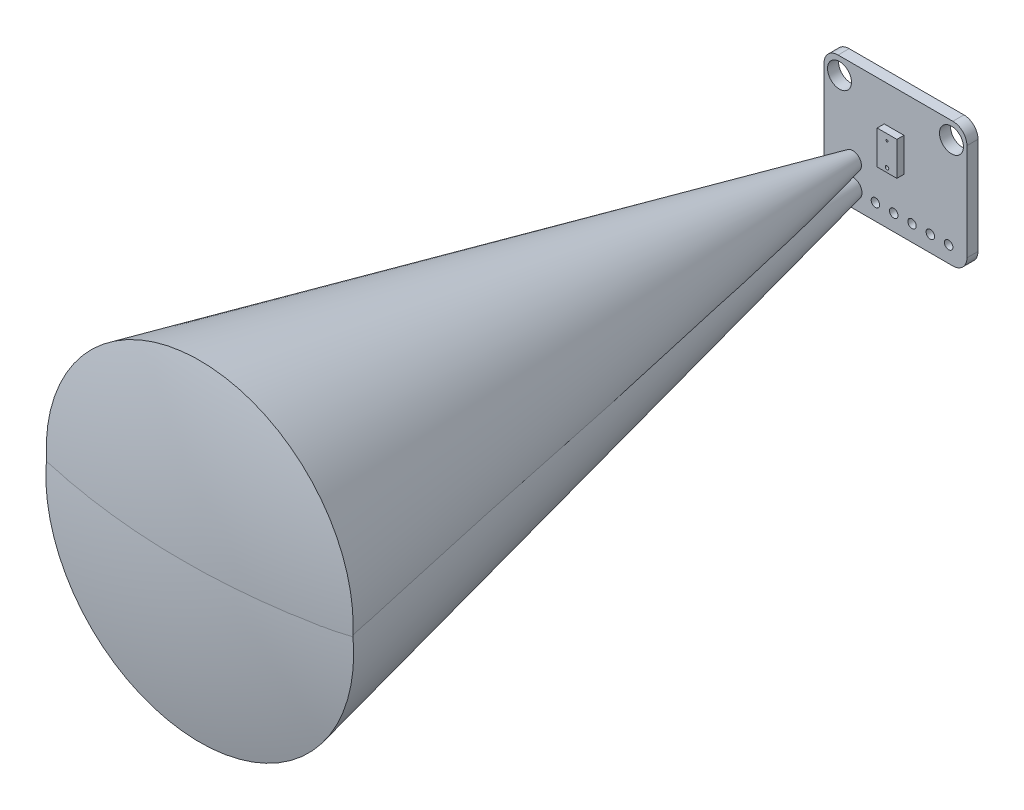
ISO-10303-21;
HEADER;
FILE_DESCRIPTION(('STEP AP214'),'2;1');
FILE_NAME('part.step','',(''),(''),'','','');
FILE_SCHEMA(('AUTOMOTIVE_DESIGN { 1 0 10303 214 1 1 1 1 }'));
ENDSEC;
DATA;
#1=APPLICATION_CONTEXT('core data for automotive mechanical design processes');
#2=APPLICATION_PROTOCOL_DEFINITION('international standard','automotive_design',2000,#1);
#3=PRODUCT_CONTEXT('',#1,'mechanical');
#4=PRODUCT('Part','Part','',(#3));
#5=PRODUCT_RELATED_PRODUCT_CATEGORY('part','',(#4));
#6=PRODUCT_DEFINITION_FORMATION('','',#4);
#7=PRODUCT_DEFINITION_CONTEXT('part definition',#1,'design');
#8=PRODUCT_DEFINITION('design','',#6,#7);
#9=PRODUCT_DEFINITION_SHAPE('','',#8);
#10=(LENGTH_UNIT() NAMED_UNIT(*) SI_UNIT(.MILLI.,.METRE.));
#11=(NAMED_UNIT(*) PLANE_ANGLE_UNIT() SI_UNIT($,.RADIAN.));
#12=(NAMED_UNIT(*) SI_UNIT($,.STERADIAN.) SOLID_ANGLE_UNIT());
#13=UNCERTAINTY_MEASURE_WITH_UNIT(LENGTH_MEASURE(1.E-05),#10,'distance_accuracy_value','');
#14=(GEOMETRIC_REPRESENTATION_CONTEXT(3) GLOBAL_UNCERTAINTY_ASSIGNED_CONTEXT((#13)) GLOBAL_UNIT_ASSIGNED_CONTEXT((#10,
#11,#12)) REPRESENTATION_CONTEXT('',''));
#15=CARTESIAN_POINT('',(0.,0.,0.));
#16=DIRECTION('',(0.,0.,1.));
#17=DIRECTION('',(1.,0.,0.));
#18=AXIS2_PLACEMENT_3D('',#15,#16,#17);
#19=CARTESIAN_POINT('',(-0.2,-0.499999999999998,1.57));
#20=DIRECTION('',(0.,0.,1.));
#21=DIRECTION('',(-1.,0.,0.));
#22=AXIS2_PLACEMENT_3D('',#19,#20,#21);
#23=SPHERICAL_SURFACE('',#22,6.);
#24=CARTESIAN_POINT('',(-0.2,-0.499999999999998,7.4277760427196));
#25=DIRECTION('',(0.,0.,1.));
#26=DIRECTION('',(1.,0.,0.));
#27=AXIS2_PLACEMENT_3D('',#24,#25,#26);
#28=CIRCLE('',#27,1.29863768362862);
#29=CARTESIAN_POINT('',(1.09863768362862,-0.499999999999998,7.4277760427196));
#30=VERTEX_POINT('',#29);
#31=EDGE_CURVE('E49',#30,#30,#28,.T.);
#32=ORIENTED_EDGE('',*,*,#31,.F.);
#33=EDGE_LOOP('',(#32));
#34=FACE_BOUND('',#33,.T.);
#35=ADVANCED_FACE('F43',(#34),#23,.F.);
#36=CARTESIAN_POINT('',(-0.2,-0.499999999999998,1.57));
#37=DIRECTION('',(0.,0.,1.));
#38=DIRECTION('',(1.,0.,0.));
#39=AXIS2_PLACEMENT_3D('',#36,#37,#38);
#40=SPHERICAL_SURFACE('',#39,101.);
#41=CARTESIAN_POINT('',(-0.2,-0.499999999999998,100.175896719113));
#42=DIRECTION('',(0.,0.,1.));
#43=DIRECTION('',(1.,0.,0.));
#44=AXIS2_PLACEMENT_3D('',#41,#42,#43);
#45=CIRCLE('',#44,21.8604010077484);
#46=CARTESIAN_POINT('',(21.6604010077484,-0.499999999999998,100.175896719113));
#47=VERTEX_POINT('',#46);
#48=EDGE_CURVE('E11',#47,#47,#45,.T.);
#49=ORIENTED_EDGE('',*,*,#48,.T.);
#50=EDGE_LOOP('',(#49));
#51=FACE_BOUND('',#50,.T.);
#52=ADVANCED_FACE('F58',(#51),#40,.T.);
#53=CARTESIAN_POINT('',(-0.2,-0.499999999999998,7.4277760427196));
#54=DIRECTION('',(0.,0.,1.));
#55=DIRECTION('',(1.,0.,0.));
#56=AXIS2_PLACEMENT_3D('',#53,#54,#55);
#57=CONICAL_SURFACE('',#56,1.29863768362862,0.218166156499292);
#58=CARTESIAN_POINT('',(21.6604010077484,-0.499999999999998,100.175896719113));
#59=CARTESIAN_POINT('',(21.4462159731222,-0.499999999999998,99.2097704620675));
#60=CARTESIAN_POINT('',(21.2320309384959,-0.499999999999998,98.2436442050218));
#61=CARTESIAN_POINT('',(20.8036608692435,-0.499999999999998,96.3113916909302));
#62=CARTESIAN_POINT('',(20.5894758346172,-0.499999999999998,95.3452654338844));
#63=CARTESIAN_POINT('',(20.1611057653647,-0.499999999999998,93.4130129197929));
#64=CARTESIAN_POINT('',(19.9469207307385,-0.499999999999998,92.4468866627472));
#65=CARTESIAN_POINT('',(19.518550661486,-0.499999999999998,90.5146341486556));
#66=CARTESIAN_POINT('',(19.3043656268597,-0.499999999999998,89.5485078916098));
#67=CARTESIAN_POINT('',(18.8759955576072,-0.499999999999998,87.6162553775183));
#68=CARTESIAN_POINT('',(18.661810522981,-0.499999999999998,86.6501291204725));
#69=CARTESIAN_POINT('',(18.2334404537285,-0.499999999999998,84.717876606381));
#70=CARTESIAN_POINT('',(18.0192554191022,-0.499999999999998,83.7517503493352));
#71=CARTESIAN_POINT('',(17.5908853498497,-0.499999999999998,81.8194978352437));
#72=CARTESIAN_POINT('',(17.3767003152235,-0.499999999999998,80.8533715781979));
#73=CARTESIAN_POINT('',(16.948330245971,-0.499999999999998,78.9211190641064));
#74=CARTESIAN_POINT('',(16.7341452113447,-0.499999999999998,77.9549928070606));
#75=CARTESIAN_POINT('',(16.3057751420922,-0.499999999999998,76.0227402929691));
#76=CARTESIAN_POINT('',(16.091590107466,-0.499999999999998,75.0566140359233));
#77=CARTESIAN_POINT('',(15.6632200382135,-0.499999999999998,73.1243615218318));
#78=CARTESIAN_POINT('',(15.4490350035872,-0.499999999999998,72.158235264786));
#79=CARTESIAN_POINT('',(15.0206649343347,-0.499999999999998,70.2259827506945));
#80=CARTESIAN_POINT('',(14.8064798997085,-0.499999999999998,69.2598564936487));
#81=CARTESIAN_POINT('',(14.378109830456,-0.499999999999998,67.3276039795572));
#82=CARTESIAN_POINT('',(14.1639247958298,-0.499999999999998,66.3614777225114));
#83=CARTESIAN_POINT('',(13.7355547265773,-0.499999999999998,64.4292252084199));
#84=CARTESIAN_POINT('',(13.521369691951,-0.499999999999998,63.4630989513741));
#85=CARTESIAN_POINT('',(13.0929996226985,-0.499999999999998,61.5308464372826));
#86=CARTESIAN_POINT('',(12.8788145880723,-0.499999999999998,60.5647201802368));
#87=CARTESIAN_POINT('',(12.4504445188198,-0.499999999999998,58.6324676661453));
#88=CARTESIAN_POINT('',(12.2362594841935,-0.499999999999998,57.6663414090995));
#89=CARTESIAN_POINT('',(11.807889414941,-0.499999999999998,55.734088895008));
#90=CARTESIAN_POINT('',(11.5937043803148,-0.499999999999998,54.7679626379622));
#91=CARTESIAN_POINT('',(11.1653343110623,-0.499999999999998,52.8357101238707));
#92=CARTESIAN_POINT('',(10.951149276436,-0.499999999999998,51.8695838668249));
#93=CARTESIAN_POINT('',(10.5227792071835,-0.499999999999998,49.9373313527334));
#94=CARTESIAN_POINT('',(10.3085941725573,-0.499999999999998,48.9712050956876));
#95=CARTESIAN_POINT('',(9.8802241033048,-0.499999999999998,47.0389525815961));
#96=CARTESIAN_POINT('',(9.66603906867855,-0.499999999999998,46.0728263245503));
#97=CARTESIAN_POINT('',(9.23766899942605,-0.499999999999998,44.1405738104588));
#98=CARTESIAN_POINT('',(9.0234839647998,-0.499999999999998,43.174447553413));
#99=CARTESIAN_POINT('',(8.5951138955473,-0.499999999999998,41.2421950393215));
#100=CARTESIAN_POINT('',(8.38092886092106,-0.499999999999998,40.2760687822757));
#101=CARTESIAN_POINT('',(7.95255879166856,-0.499999999999998,38.3438162681842));
#102=CARTESIAN_POINT('',(7.73837375704231,-0.499999999999998,37.3776900111384));
#103=CARTESIAN_POINT('',(7.31000368778982,-0.499999999999998,35.4454374970469));
#104=CARTESIAN_POINT('',(7.09581865316357,-0.499999999999998,34.4793112400011));
#105=CARTESIAN_POINT('',(6.66744858391107,-0.499999999999998,32.5470587259096));
#106=CARTESIAN_POINT('',(6.45326354928482,-0.499999999999998,31.5809324688638));
#107=CARTESIAN_POINT('',(6.02489348003233,-0.499999999999998,29.6486799547723));
#108=CARTESIAN_POINT('',(5.81070844540608,-0.499999999999998,28.6825536977265));
#109=CARTESIAN_POINT('',(5.38233837615358,-0.499999999999998,26.7503011836349));
#110=CARTESIAN_POINT('',(5.16815334152733,-0.499999999999998,25.7841749265892));
#111=CARTESIAN_POINT('',(4.73978327227484,-0.499999999999998,23.8519224124976));
#112=CARTESIAN_POINT('',(4.52559823764859,-0.499999999999998,22.8857961554519));
#113=CARTESIAN_POINT('',(4.09722816839609,-0.499999999999998,20.9535436413603));
#114=CARTESIAN_POINT('',(3.88304313376985,-0.499999999999998,19.9874173843146));
#115=CARTESIAN_POINT('',(3.45467306451735,-0.499999999999998,18.055164870223));
#116=CARTESIAN_POINT('',(3.2404880298911,-0.499999999999998,17.0890386131773));
#117=CARTESIAN_POINT('',(2.8121179606386,-0.499999999999998,15.1567860990857));
#118=CARTESIAN_POINT('',(2.59793292601236,-0.499999999999998,14.19065984204));
#119=CARTESIAN_POINT('',(2.16956285675986,-0.499999999999998,12.2584073279484));
#120=CARTESIAN_POINT('',(1.95537782213361,-0.499999999999998,11.2922810709027));
#121=CARTESIAN_POINT('',(1.52700775288112,-0.499999999999998,9.36002855681113));
#122=CARTESIAN_POINT('',(1.31282271825487,-0.499999999999998,8.39390229976537));
#123=CARTESIAN_POINT('',(1.09863768362862,-0.499999999999998,7.4277760427196));
#124=B_SPLINE_CURVE_WITH_KNOTS('',3,(#58,#59,#60,#61,#62,#63,#64,#65,#66,#67,#68,#69,#70,#71,
#72,#73,#74,#75,#76,#77,#78,#79,#80,#81,#82,#83,#84,#85,#86,#87,#88,#89,#90,#91,#92,#93,#94,#95,
#96,#97,#98,#99,#100,#101,#102,#103,#104,#105,#106,#107,#108,#109,#110,#111,#112,#113,#114,#115,
#116,#117,#118,#119,#120,#121,#122,#123),.UNSPECIFIED.,.F.,.F.,(4,2,2,2,2,2,2,2,2,2,2,2,2,2,2,2,
2,2,2,2,2,2,2,2,2,2,2,2,2,2,2,2,4),(0.,2.96875,5.9375,8.90624999999999,11.875,14.84375,17.8125,
20.78125,23.75,26.71875,29.6875,32.65625,35.625,38.59375,41.5625,44.53125,47.5,50.46875,53.4375,
56.40625,59.375,62.34375,65.3125,68.28125,71.25,74.21875,77.1875,80.15625,83.125,86.09375,
89.0625,92.03125,95.),.UNSPECIFIED.);
#125=EDGE_CURVE('BSEAM55',#47,#30,#124,.T.);
#126=ORIENTED_EDGE('',*,*,#48,.F.);
#127=ORIENTED_EDGE('',*,*,#31,.T.);
#128=ORIENTED_EDGE('',*,*,#125,.T.);
#129=ORIENTED_EDGE('',*,*,#125,.F.);
#130=EDGE_LOOP('',(#126,#128,#127,#129));
#131=FACE_BOUND('',#130,.T.);
#132=ADVANCED_FACE('F55',(#131),#57,.T.);
#133=CLOSED_SHELL('',(#35,#52,#132));
#134=MANIFOLD_SOLID_BREP('B2',#133);
#135=CARTESIAN_POINT('',(-0.200000000000001,2.82,1.86));
#136=DIRECTION('',(0.,0.,-1.));
#137=DIRECTION('',(-1.,0.,0.));
#138=AXIS2_PLACEMENT_3D('',#135,#136,#137);
#139=SPHERICAL_SURFACE('',#138,5.71);
#140=CARTESIAN_POINT('',(-0.200000000000002,2.82,7.43465020065482));
#141=DIRECTION('',(0.,0.,-1.));
#142=DIRECTION('',(-1.,0.,0.));
#143=AXIS2_PLACEMENT_3D('',#140,#141,#142);
#144=CIRCLE('',#143,1.23587019558657);
#145=CARTESIAN_POINT('',(1.03587019558657,2.82,7.43465020065482));
#146=VERTEX_POINT('',#145);
#147=EDGE_CURVE('E98',#146,#146,#144,.T.);
#148=ORIENTED_EDGE('',*,*,#147,.T.);
#149=EDGE_LOOP('',(#148));
#150=FACE_BOUND('',#149,.T.);
#151=ADVANCED_FACE('F92',(#150),#139,.F.);
#152=CARTESIAN_POINT('',(-0.200000000000001,2.82,1.86));
#153=DIRECTION('',(0.,0.,-1.));
#154=DIRECTION('',(1.,0.,0.));
#155=AXIS2_PLACEMENT_3D('',#152,#153,#154);
#156=SPHERICAL_SURFACE('',#155,100.71);
#157=CARTESIAN_POINT('',(-0.200000000000019,2.82,100.182770877048));
#158=DIRECTION('',(0.,0.,-1.));
#159=DIRECTION('',(-1.,0.,0.));
#160=AXIS2_PLACEMENT_3D('',#157,#158,#159);
#161=CIRCLE('',#160,21.7976335197065);
#162=CARTESIAN_POINT('',(21.5976335197064,2.82,100.182770877048));
#163=VERTEX_POINT('',#162);
#164=EDGE_CURVE('E42',#163,#163,#161,.T.);
#165=ORIENTED_EDGE('',*,*,#164,.F.);
#166=EDGE_LOOP('',(#165));
#167=FACE_BOUND('',#166,.T.);
#168=ADVANCED_FACE('F107',(#167),#156,.T.);
#169=CARTESIAN_POINT('',(-0.200000000000002,2.82,7.43465020065482));
#170=DIRECTION('',(0.,0.,1.));
#171=DIRECTION('',(1.,0.,0.));
#172=AXIS2_PLACEMENT_3D('',#169,#170,#171);
#173=CONICAL_SURFACE('',#172,1.23587019558657,0.218166156499292);
#174=CARTESIAN_POINT('',(21.5976335197064,2.82,100.182770877048));
#175=CARTESIAN_POINT('',(21.3834484850802,2.82,99.2166446200027));
#176=CARTESIAN_POINT('',(21.1692634504539,2.82,98.250518362957));
#177=CARTESIAN_POINT('',(20.7408933812014,2.82,96.3182658488654));
#178=CARTESIAN_POINT('',(20.5267083465752,2.82,95.3521395918197));
#179=CARTESIAN_POINT('',(20.0983382773227,2.82,93.4198870777281));
#180=CARTESIAN_POINT('',(19.8841532426964,2.82,92.4537608206823));
#181=CARTESIAN_POINT('',(19.4557831734439,2.82,90.5215083065908));
#182=CARTESIAN_POINT('',(19.2415981388177,2.82,89.555382049545));
#183=CARTESIAN_POINT('',(18.8132280695652,2.82,87.6231295354535));
#184=CARTESIAN_POINT('',(18.599043034939,2.82,86.6570032784077));
#185=CARTESIAN_POINT('',(18.1706729656865,2.82,84.7247507643162));
#186=CARTESIAN_POINT('',(17.9564879310602,2.82,83.7586245072704));
#187=CARTESIAN_POINT('',(17.5281178618077,2.82,81.8263719931789));
#188=CARTESIAN_POINT('',(17.3139328271815,2.82,80.8602457361331));
#189=CARTESIAN_POINT('',(16.885562757929,2.82,78.9279932220416));
#190=CARTESIAN_POINT('',(16.6713777233027,2.82,77.9618669649958));
#191=CARTESIAN_POINT('',(16.2430076540502,2.82,76.0296144509043));
#192=CARTESIAN_POINT('',(16.028822619424,2.82,75.0634881938585));
#193=CARTESIAN_POINT('',(15.6004525501715,2.82,73.131235679767));
#194=CARTESIAN_POINT('',(15.3862675155452,2.82,72.1651094227212));
#195=CARTESIAN_POINT('',(14.9578974462927,2.82,70.2328569086297));
#196=CARTESIAN_POINT('',(14.7437124116665,2.82,69.2667306515839));
#197=CARTESIAN_POINT('',(14.315342342414,2.82,67.3344781374924));
#198=CARTESIAN_POINT('',(14.1011573077877,2.82,66.3683518804466));
#199=CARTESIAN_POINT('',(13.6727872385352,2.82,64.4360993663551));
#200=CARTESIAN_POINT('',(13.458602203909,2.82,63.4699731093093));
#201=CARTESIAN_POINT('',(13.0302321346565,2.82,61.5377205952178));
#202=CARTESIAN_POINT('',(12.8160471000302,2.82,60.571594338172));
#203=CARTESIAN_POINT('',(12.3876770307777,2.82,58.6393418240805));
#204=CARTESIAN_POINT('',(12.1734919961515,2.82,57.6732155670347));
#205=CARTESIAN_POINT('',(11.745121926899,2.82,55.7409630529432));
#206=CARTESIAN_POINT('',(11.5309368922728,2.82,54.7748367958974));
#207=CARTESIAN_POINT('',(11.1025668230203,2.82,52.8425842818059));
#208=CARTESIAN_POINT('',(10.888381788394,2.82,51.8764580247601));
#209=CARTESIAN_POINT('',(10.4600117191415,2.82,49.9442055106686));
#210=CARTESIAN_POINT('',(10.2458266845153,2.82,48.9780792536228));
#211=CARTESIAN_POINT('',(9.81745661526276,2.82,47.0458267395313));
#212=CARTESIAN_POINT('',(9.60327158063651,2.82,46.0797004824855));
#213=CARTESIAN_POINT('',(9.17490151138402,2.82,44.147447968394));
#214=CARTESIAN_POINT('',(8.96071647675777,2.82,43.1813217113482));
#215=CARTESIAN_POINT('',(8.53234640750527,2.82,41.2490691972567));
#216=CARTESIAN_POINT('',(8.31816137287902,2.82,40.2829429402109));
#217=CARTESIAN_POINT('',(7.88979130362653,2.82,38.3506904261194));
#218=CARTESIAN_POINT('',(7.67560626900028,2.82,37.3845641690736));
#219=CARTESIAN_POINT('',(7.24723619974778,2.82,35.4523116549821));
#220=CARTESIAN_POINT('',(7.03305116512153,2.82,34.4861853979363));
#221=CARTESIAN_POINT('',(6.60468109586903,2.82,32.5539328838448));
#222=CARTESIAN_POINT('',(6.39049606124278,2.82,31.587806626799));
#223=CARTESIAN_POINT('',(5.96212599199029,2.82,29.6555541127075));
#224=CARTESIAN_POINT('',(5.74794095736404,2.82,28.6894278556617));
#225=CARTESIAN_POINT('',(5.31957088811154,2.82,26.7571753415702));
#226=CARTESIAN_POINT('',(5.10538585348529,2.82,25.7910490845244));
#227=CARTESIAN_POINT('',(4.6770157842328,2.82,23.8587965704329));
#228=CARTESIAN_POINT('',(4.46283074960655,2.82,22.8926703133871));
#229=CARTESIAN_POINT('',(4.03446068035405,2.82,20.9604177992956));
#230=CARTESIAN_POINT('',(3.8202756457278,2.82,19.9942915422498));
#231=CARTESIAN_POINT('',(3.3919055764753,2.82,18.0620390281583));
#232=CARTESIAN_POINT('',(3.17772054184906,2.82,17.0959127711125));
#233=CARTESIAN_POINT('',(2.74935047259656,2.82,15.163660257021));
#234=CARTESIAN_POINT('',(2.53516543797031,2.82,14.1975339999752));
#235=CARTESIAN_POINT('',(2.10679536871781,2.82,12.2652814858837));
#236=CARTESIAN_POINT('',(1.89261033409157,2.82,11.2991552288379));
#237=CARTESIAN_POINT('',(1.46424026483907,2.82,9.36690271474635));
#238=CARTESIAN_POINT('',(1.25005523021282,2.82,8.40077645770059));
#239=CARTESIAN_POINT('',(1.03587019558657,2.82,7.43465020065482));
#240=B_SPLINE_CURVE_WITH_KNOTS('',3,(#174,#175,#176,#177,#178,#179,#180,#181,#182,#183,#184,
#185,#186,#187,#188,#189,#190,#191,#192,#193,#194,#195,#196,#197,#198,#199,#200,#201,#202,#203,
#204,#205,#206,#207,#208,#209,#210,#211,#212,#213,#214,#215,#216,#217,#218,#219,#220,#221,#222,
#223,#224,#225,#226,#227,#228,#229,#230,#231,#232,#233,#234,#235,#236,#237,#238,#239),
.UNSPECIFIED.,.F.,.F.,(4,2,2,2,2,2,2,2,2,2,2,2,2,2,2,2,2,2,2,2,2,2,2,2,2,2,2,2,2,2,2,2,4),(0.,
2.96875,5.9375,8.90624999999999,11.875,14.84375,17.8125,20.78125,23.75,26.71875,29.6875,
32.65625,35.625,38.59375,41.5625,44.53125,47.5,50.46875,53.4375,56.40625,59.375,62.34375,
65.3125,68.28125,71.25,74.21875,77.1875,80.15625,83.125,86.09375,89.0625,92.03125,95.),.UNSPECIFIED.);
#241=EDGE_CURVE('BSEAM105',#163,#146,#240,.T.);
#242=ORIENTED_EDGE('',*,*,#164,.T.);
#243=ORIENTED_EDGE('',*,*,#147,.F.);
#244=ORIENTED_EDGE('',*,*,#241,.T.);
#245=ORIENTED_EDGE('',*,*,#241,.F.);
#246=EDGE_LOOP('',(#242,#244,#243,#245));
#247=FACE_BOUND('',#246,.T.);
#248=ADVANCED_FACE('F105',(#247),#173,.T.);
#249=CLOSED_SHELL('',(#151,#168,#248));
#250=MANIFOLD_SOLID_BREP('B6',#249);
#251=CARTESIAN_POINT('',(10.15,-8.9,1.57));
#252=DIRECTION('',(-1.,0.,0.));
#253=DIRECTION('',(0.,0.,1.));
#254=AXIS2_PLACEMENT_3D('',#251,#252,#253);
#255=PLANE('',#254);
#256=DIRECTION('',(0.,1.,0.));
#257=VECTOR('',#256,1.);
#258=CARTESIAN_POINT('',(10.15,-8.9,1.57));
#259=LINE('',#258,#257);
#260=CARTESIAN_POINT('',(10.15,-6.9,1.57));
#261=VERTEX_POINT('',#260);
#262=CARTESIAN_POINT('',(10.15,6.9,1.57));
#263=VERTEX_POINT('',#262);
#264=EDGE_CURVE('E302',#261,#263,#259,.T.);
#265=ORIENTED_EDGE('',*,*,#264,.F.);
#266=DIRECTION('',(0.,0.,-1.));
#267=VECTOR('',#266,1.);
#268=CARTESIAN_POINT('',(10.15,-6.9,1.57));
#269=LINE('',#268,#267);
#270=CARTESIAN_POINT('',(10.15,-6.9,0.));
#271=VERTEX_POINT('',#270);
#272=EDGE_CURVE('E327',#261,#271,#269,.T.);
#273=ORIENTED_EDGE('',*,*,#272,.T.);
#274=DIRECTION('',(0.,1.,0.));
#275=VECTOR('',#274,1.);
#276=CARTESIAN_POINT('',(10.15,-8.9,0.));
#277=LINE('',#276,#275);
#278=CARTESIAN_POINT('',(10.15,6.9,0.));
#279=VERTEX_POINT('',#278);
#280=EDGE_CURVE('E299',#271,#279,#277,.T.);
#281=ORIENTED_EDGE('',*,*,#280,.T.);
#282=DIRECTION('',(0.,0.,-1.));
#283=VECTOR('',#282,1.);
#284=CARTESIAN_POINT('',(10.15,6.9,1.57));
#285=LINE('',#284,#283);
#286=EDGE_CURVE('E315',#279,#263,#285,.F.);
#287=ORIENTED_EDGE('',*,*,#286,.T.);
#288=EDGE_LOOP('',(#265,#273,#281,#287));
#289=FACE_BOUND('',#288,.T.);
#290=ADVANCED_FACE('F132',(#289),#255,.F.);
#291=CARTESIAN_POINT('',(-10.15,8.9,1.57));
#292=DIRECTION('',(0.,-1.,0.));
#293=DIRECTION('',(0.,0.,-1.));
#294=AXIS2_PLACEMENT_3D('',#291,#292,#293);
#295=PLANE('',#294);
#296=DIRECTION('',(-1.,0.,0.));
#297=VECTOR('',#296,1.);
#298=CARTESIAN_POINT('',(-10.15,8.9,1.57));
#299=LINE('',#298,#297);
#300=CARTESIAN_POINT('',(8.15,8.9,1.57));
#301=VERTEX_POINT('',#300);
#302=CARTESIAN_POINT('',(-8.15,8.9,1.57));
#303=VERTEX_POINT('',#302);
#304=EDGE_CURVE('E305',#301,#303,#299,.T.);
#305=ORIENTED_EDGE('',*,*,#304,.F.);
#306=DIRECTION('',(0.,0.,-1.));
#307=VECTOR('',#306,1.);
#308=CARTESIAN_POINT('',(8.15,8.9,1.57));
#309=LINE('',#308,#307);
#310=CARTESIAN_POINT('',(8.15,8.9,0.));
#311=VERTEX_POINT('',#310);
#312=EDGE_CURVE('E353',#301,#311,#309,.T.);
#313=ORIENTED_EDGE('',*,*,#312,.T.);
#314=DIRECTION('',(-1.,0.,0.));
#315=VECTOR('',#314,1.);
#316=CARTESIAN_POINT('',(-10.15,8.9,0.));
#317=LINE('',#316,#315);
#318=CARTESIAN_POINT('',(-8.15,8.9,0.));
#319=VERTEX_POINT('',#318);
#320=EDGE_CURVE('E318',#311,#319,#317,.T.);
#321=ORIENTED_EDGE('',*,*,#320,.T.);
#322=DIRECTION('',(0.,0.,-1.));
#323=VECTOR('',#322,1.);
#324=CARTESIAN_POINT('',(-8.15,8.9,1.57));
#325=LINE('',#324,#323);
#326=EDGE_CURVE('E351',#319,#303,#325,.F.);
#327=ORIENTED_EDGE('',*,*,#326,.T.);
#328=EDGE_LOOP('',(#305,#313,#321,#327));
#329=FACE_BOUND('',#328,.T.);
#330=ADVANCED_FACE('F392',(#329),#295,.F.);
#331=CARTESIAN_POINT('',(-10.15,-8.9,1.57));
#332=DIRECTION('',(1.,0.,0.));
#333=DIRECTION('',(0.,0.,-1.));
#334=AXIS2_PLACEMENT_3D('',#331,#332,#333);
#335=PLANE('',#334);
#336=DIRECTION('',(0.,-1.,0.));
#337=VECTOR('',#336,1.);
#338=CARTESIAN_POINT('',(-10.15,-8.9,0.));
#339=LINE('',#338,#337);
#340=CARTESIAN_POINT('',(-10.15,6.9,0.));
#341=VERTEX_POINT('',#340);
#342=CARTESIAN_POINT('',(-10.15,-6.9,0.));
#343=VERTEX_POINT('',#342);
#344=EDGE_CURVE('E321',#341,#343,#339,.T.);
#345=ORIENTED_EDGE('',*,*,#344,.T.);
#346=DIRECTION('',(0.,0.,-1.));
#347=VECTOR('',#346,1.);
#348=CARTESIAN_POINT('',(-10.15,-6.9,1.57));
#349=LINE('',#348,#347);
#350=CARTESIAN_POINT('',(-10.15,-6.9,1.57));
#351=VERTEX_POINT('',#350);
#352=EDGE_CURVE('E90',#343,#351,#349,.F.);
#353=ORIENTED_EDGE('',*,*,#352,.T.);
#354=DIRECTION('',(0.,-1.,0.));
#355=VECTOR('',#354,1.);
#356=CARTESIAN_POINT('',(-10.15,-8.9,1.57));
#357=LINE('',#356,#355);
#358=CARTESIAN_POINT('',(-10.15,6.9,1.57));
#359=VERTEX_POINT('',#358);
#360=EDGE_CURVE('E309',#359,#351,#357,.T.);
#361=ORIENTED_EDGE('',*,*,#360,.F.);
#362=DIRECTION('',(0.,0.,-1.));
#363=VECTOR('',#362,1.);
#364=CARTESIAN_POINT('',(-10.15,6.9,1.57));
#365=LINE('',#364,#363);
#366=EDGE_CURVE('E140',#359,#341,#365,.T.);
#367=ORIENTED_EDGE('',*,*,#366,.T.);
#368=EDGE_LOOP('',(#345,#353,#361,#367));
#369=FACE_BOUND('',#368,.T.);
#370=ADVANCED_FACE('F360',(#369),#335,.F.);
#371=CARTESIAN_POINT('',(-10.15,-8.9,1.57));
#372=DIRECTION('',(0.,1.,0.));
#373=DIRECTION('',(0.,0.,1.));
#374=AXIS2_PLACEMENT_3D('',#371,#372,#373);
#375=PLANE('',#374);
#376=DIRECTION('',(1.,0.,0.));
#377=VECTOR('',#376,1.);
#378=CARTESIAN_POINT('',(-10.15,-8.9,0.));
#379=LINE('',#378,#377);
#380=CARTESIAN_POINT('',(-8.15,-8.9,0.));
#381=VERTEX_POINT('',#380);
#382=CARTESIAN_POINT('',(8.15,-8.9,0.));
#383=VERTEX_POINT('',#382);
#384=EDGE_CURVE('E306',#381,#383,#379,.T.);
#385=ORIENTED_EDGE('',*,*,#384,.T.);
#386=DIRECTION('',(0.,0.,-1.));
#387=VECTOR('',#386,1.);
#388=CARTESIAN_POINT('',(8.15,-8.9,1.57));
#389=LINE('',#388,#387);
#390=CARTESIAN_POINT('',(8.15,-8.9,1.57));
#391=VERTEX_POINT('',#390);
#392=EDGE_CURVE('E341',#383,#391,#389,.F.);
#393=ORIENTED_EDGE('',*,*,#392,.T.);
#394=DIRECTION('',(1.,0.,0.));
#395=VECTOR('',#394,1.);
#396=CARTESIAN_POINT('',(-10.15,-8.9,1.57));
#397=LINE('',#396,#395);
#398=CARTESIAN_POINT('',(-8.15,-8.9,1.57));
#399=VERTEX_POINT('',#398);
#400=EDGE_CURVE('E312',#399,#391,#397,.T.);
#401=ORIENTED_EDGE('',*,*,#400,.F.);
#402=DIRECTION('',(0.,0.,-1.));
#403=VECTOR('',#402,1.);
#404=CARTESIAN_POINT('',(-8.15,-8.9,1.57));
#405=LINE('',#404,#403);
#406=EDGE_CURVE('E338',#399,#381,#405,.T.);
#407=ORIENTED_EDGE('',*,*,#406,.T.);
#408=EDGE_LOOP('',(#385,#393,#401,#407));
#409=FACE_BOUND('',#408,.T.);
#410=ADVANCED_FACE('F375',(#409),#375,.F.);
#411=CARTESIAN_POINT('',(0.,0.,1.57));
#412=DIRECTION('',(0.,0.,-1.));
#413=DIRECTION('',(-1.,0.,0.));
#414=AXIS2_PLACEMENT_3D('',#411,#412,#413);
#415=PLANE('',#414);
#416=DIRECTION('',(0.,-1.,0.));
#417=VECTOR('',#416,1.);
#418=CARTESIAN_POINT('',(-1.6,3.7,1.57));
#419=LINE('',#418,#417);
#420=CARTESIAN_POINT('',(-1.6,3.7,1.57));
#421=VERTEX_POINT('',#420);
#422=CARTESIAN_POINT('',(-1.6,-1.1,1.57));
#423=VERTEX_POINT('',#422);
#424=EDGE_CURVE('E241',#421,#423,#419,.T.);
#425=ORIENTED_EDGE('',*,*,#424,.F.);
#426=DIRECTION('',(-1.,0.,0.));
#427=VECTOR('',#426,1.);
#428=CARTESIAN_POINT('',(-1.6,3.7,1.57));
#429=LINE('',#428,#427);
#430=CARTESIAN_POINT('',(1.2,3.7,1.57));
#431=VERTEX_POINT('',#430);
#432=EDGE_CURVE('E238',#431,#421,#429,.T.);
#433=ORIENTED_EDGE('',*,*,#432,.F.);
#434=DIRECTION('',(0.,1.,0.));
#435=VECTOR('',#434,1.);
#436=CARTESIAN_POINT('',(1.2,3.7,1.57));
#437=LINE('',#436,#435);
#438=CARTESIAN_POINT('',(1.2,-1.1,1.57));
#439=VERTEX_POINT('',#438);
#440=EDGE_CURVE('E152',#439,#431,#437,.T.);
#441=ORIENTED_EDGE('',*,*,#440,.F.);
#442=DIRECTION('',(1.,0.,0.));
#443=VECTOR('',#442,1.);
#444=CARTESIAN_POINT('',(-1.6,-1.1,1.57));
#445=LINE('',#444,#443);
#446=EDGE_CURVE('E147',#423,#439,#445,.T.);
#447=ORIENTED_EDGE('',*,*,#446,.F.);
#448=EDGE_LOOP('',(#425,#433,#441,#447));
#449=FACE_BOUND('',#448,.T.);
#450=CARTESIAN_POINT('',(-2.85,-6.6,1.57));
#451=DIRECTION('',(0.,0.,1.));
#452=DIRECTION('',(1.,0.,0.));
#453=AXIS2_PLACEMENT_3D('',#450,#451,#452);
#454=CIRCLE('',#453,0.6);
#455=CARTESIAN_POINT('',(-2.25,-6.6,1.57));
#456=VERTEX_POINT('',#455);
#457=EDGE_CURVE('E254',#456,#456,#454,.T.);
#458=ORIENTED_EDGE('',*,*,#457,.F.);
#459=EDGE_LOOP('',(#458));
#460=FACE_BOUND('',#459,.T.);
#461=CARTESIAN_POINT('',(-5.45,-6.6,1.57));
#462=DIRECTION('',(0.,0.,1.));
#463=DIRECTION('',(1.,0.,0.));
#464=AXIS2_PLACEMENT_3D('',#461,#462,#463);
#465=CIRCLE('',#464,0.6);
#466=CARTESIAN_POINT('',(-4.85,-6.6,1.57));
#467=VERTEX_POINT('',#466);
#468=EDGE_CURVE('E276',#467,#467,#465,.T.);
#469=ORIENTED_EDGE('',*,*,#468,.F.);
#470=EDGE_LOOP('',(#469));
#471=FACE_BOUND('',#470,.T.);
#472=CARTESIAN_POINT('',(-8.05,-6.6,1.57));
#473=DIRECTION('',(0.,0.,1.));
#474=DIRECTION('',(1.,0.,0.));
#475=AXIS2_PLACEMENT_3D('',#472,#473,#474);
#476=CIRCLE('',#475,0.6);
#477=CARTESIAN_POINT('',(-7.45,-6.6,1.57));
#478=VERTEX_POINT('',#477);
#479=EDGE_CURVE('E275',#478,#478,#476,.T.);
#480=ORIENTED_EDGE('',*,*,#479,.F.);
#481=EDGE_LOOP('',(#480));
#482=FACE_BOUND('',#481,.T.);
#483=CARTESIAN_POINT('',(7.95,6.5,1.57));
#484=DIRECTION('',(0.,0.,1.));
#485=DIRECTION('',(1.,0.,0.));
#486=AXIS2_PLACEMENT_3D('',#483,#484,#485);
#487=CIRCLE('',#486,1.7);
#488=CARTESIAN_POINT('',(9.65,6.5,1.57));
#489=VERTEX_POINT('',#488);
#490=EDGE_CURVE('E288',#489,#489,#487,.T.);
#491=ORIENTED_EDGE('',*,*,#490,.F.);
#492=EDGE_LOOP('',(#491));
#493=FACE_BOUND('',#492,.T.);
#494=CARTESIAN_POINT('',(-0.250000000000002,-6.6,1.57));
#495=DIRECTION('',(0.,0.,1.));
#496=DIRECTION('',(1.,0.,0.));
#497=AXIS2_PLACEMENT_3D('',#494,#495,#496);
#498=CIRCLE('',#497,0.6);
#499=CARTESIAN_POINT('',(0.349999999999998,-6.6,1.57));
#500=VERTEX_POINT('',#499);
#501=EDGE_CURVE('E255',#500,#500,#498,.T.);
#502=ORIENTED_EDGE('',*,*,#501,.F.);
#503=EDGE_LOOP('',(#502));
#504=FACE_BOUND('',#503,.T.);
#505=CARTESIAN_POINT('',(2.35,-6.6,1.57));
#506=DIRECTION('',(0.,0.,1.));
#507=DIRECTION('',(1.,0.,0.));
#508=AXIS2_PLACEMENT_3D('',#505,#506,#507);
#509=CIRCLE('',#508,0.6);
#510=CARTESIAN_POINT('',(2.95,-6.6,1.57));
#511=VERTEX_POINT('',#510);
#512=EDGE_CURVE('E261',#511,#511,#509,.T.);
#513=ORIENTED_EDGE('',*,*,#512,.F.);
#514=EDGE_LOOP('',(#513));
#515=FACE_BOUND('',#514,.T.);
#516=CARTESIAN_POINT('',(4.95,-6.6,1.57));
#517=DIRECTION('',(0.,0.,1.));
#518=DIRECTION('',(1.,0.,0.));
#519=AXIS2_PLACEMENT_3D('',#516,#517,#518);
#520=CIRCLE('',#519,0.6);
#521=CARTESIAN_POINT('',(5.55,-6.6,1.57));
#522=VERTEX_POINT('',#521);
#523=EDGE_CURVE('E267',#522,#522,#520,.T.);
#524=ORIENTED_EDGE('',*,*,#523,.F.);
#525=EDGE_LOOP('',(#524));
#526=FACE_BOUND('',#525,.T.);
#527=CARTESIAN_POINT('',(7.55,-6.6,1.57));
#528=DIRECTION('',(0.,0.,1.));
#529=DIRECTION('',(1.,0.,0.));
#530=AXIS2_PLACEMENT_3D('',#527,#528,#529);
#531=CIRCLE('',#530,0.6);
#532=CARTESIAN_POINT('',(8.15,-6.6,1.57));
#533=VERTEX_POINT('',#532);
#534=EDGE_CURVE('E242',#533,#533,#531,.T.);
#535=ORIENTED_EDGE('',*,*,#534,.F.);
#536=EDGE_LOOP('',(#535));
#537=FACE_BOUND('',#536,.T.);
#538=CARTESIAN_POINT('',(-7.95,6.5,1.57));
#539=DIRECTION('',(0.,0.,1.));
#540=DIRECTION('',(1.,0.,0.));
#541=AXIS2_PLACEMENT_3D('',#538,#539,#540);
#542=CIRCLE('',#541,1.7);
#543=CARTESIAN_POINT('',(-6.25,6.5,1.57));
#544=VERTEX_POINT('',#543);
#545=EDGE_CURVE('E287',#544,#544,#542,.T.);
#546=ORIENTED_EDGE('',*,*,#545,.F.);
#547=EDGE_LOOP('',(#546));
#548=FACE_BOUND('',#547,.T.);
#549=ORIENTED_EDGE('',*,*,#400,.T.);
#550=CARTESIAN_POINT('',(8.15,-6.9,1.57));
#551=DIRECTION('',(0.,0.,-1.));
#552=DIRECTION('',(-1.,0.,0.));
#553=AXIS2_PLACEMENT_3D('',#550,#551,#552);
#554=CIRCLE('',#553,2.);
#555=EDGE_CURVE('E349',#391,#261,#554,.F.);
#556=ORIENTED_EDGE('',*,*,#555,.T.);
#557=ORIENTED_EDGE('',*,*,#264,.T.);
#558=CARTESIAN_POINT('',(8.15,6.9,1.57));
#559=DIRECTION('',(0.,0.,-1.));
#560=DIRECTION('',(-1.,0.,0.));
#561=AXIS2_PLACEMENT_3D('',#558,#559,#560);
#562=CIRCLE('',#561,2.);
#563=EDGE_CURVE('E347',#263,#301,#562,.F.);
#564=ORIENTED_EDGE('',*,*,#563,.T.);
#565=ORIENTED_EDGE('',*,*,#304,.T.);
#566=CARTESIAN_POINT('',(-8.15,6.9,1.57));
#567=DIRECTION('',(0.,0.,-1.));
#568=DIRECTION('',(-1.,0.,0.));
#569=AXIS2_PLACEMENT_3D('',#566,#567,#568);
#570=CIRCLE('',#569,2.);
#571=EDGE_CURVE('E343',#303,#359,#570,.F.);
#572=ORIENTED_EDGE('',*,*,#571,.T.);
#573=ORIENTED_EDGE('',*,*,#360,.T.);
#574=CARTESIAN_POINT('',(-8.15,-6.9,1.57));
#575=DIRECTION('',(0.,0.,-1.));
#576=DIRECTION('',(-1.,0.,0.));
#577=AXIS2_PLACEMENT_3D('',#574,#575,#576);
#578=CIRCLE('',#577,2.);
#579=EDGE_CURVE('E345',#351,#399,#578,.F.);
#580=ORIENTED_EDGE('',*,*,#579,.T.);
#581=EDGE_LOOP('',(#549,#556,#557,#564,#565,#572,#573,#580));
#582=FACE_BOUND('',#581,.T.);
#583=ADVANCED_FACE('F379',(#449,#460,#471,#482,#493,#504,#515,#526,#537,#548,#582),#415,.F.);
#584=CARTESIAN_POINT('',(0.,0.,0.));
#585=DIRECTION('',(0.,0.,-1.));
#586=DIRECTION('',(-1.,0.,0.));
#587=AXIS2_PLACEMENT_3D('',#584,#585,#586);
#588=PLANE('',#587);
#589=CARTESIAN_POINT('',(-2.85,-6.6,0.));
#590=DIRECTION('',(0.,0.,1.));
#591=DIRECTION('',(1.,0.,0.));
#592=AXIS2_PLACEMENT_3D('',#589,#590,#591);
#593=CIRCLE('',#592,0.6);
#594=CARTESIAN_POINT('',(-2.25,-6.6,0.));
#595=VERTEX_POINT('',#594);
#596=EDGE_CURVE('E279',#595,#595,#593,.T.);
#597=ORIENTED_EDGE('',*,*,#596,.T.);
#598=EDGE_LOOP('',(#597));
#599=FACE_BOUND('',#598,.T.);
#600=CARTESIAN_POINT('',(-5.45,-6.6,0.));
#601=DIRECTION('',(0.,0.,1.));
#602=DIRECTION('',(1.,0.,0.));
#603=AXIS2_PLACEMENT_3D('',#600,#601,#602);
#604=CIRCLE('',#603,0.6);
#605=CARTESIAN_POINT('',(-4.85,-6.6,0.));
#606=VERTEX_POINT('',#605);
#607=EDGE_CURVE('E272',#606,#606,#604,.T.);
#608=ORIENTED_EDGE('',*,*,#607,.T.);
#609=EDGE_LOOP('',(#608));
#610=FACE_BOUND('',#609,.T.);
#611=CARTESIAN_POINT('',(-8.05,-6.6,0.));
#612=DIRECTION('',(0.,0.,1.));
#613=DIRECTION('',(1.,0.,0.));
#614=AXIS2_PLACEMENT_3D('',#611,#612,#613);
#615=CIRCLE('',#614,0.6);
#616=CARTESIAN_POINT('',(-7.45,-6.6,0.));
#617=VERTEX_POINT('',#616);
#618=EDGE_CURVE('E291',#617,#617,#615,.T.);
#619=ORIENTED_EDGE('',*,*,#618,.T.);
#620=EDGE_LOOP('',(#619));
#621=FACE_BOUND('',#620,.T.);
#622=CARTESIAN_POINT('',(7.95,6.5,0.));
#623=DIRECTION('',(0.,0.,1.));
#624=DIRECTION('',(1.,0.,0.));
#625=AXIS2_PLACEMENT_3D('',#622,#623,#624);
#626=CIRCLE('',#625,1.7);
#627=CARTESIAN_POINT('',(9.65,6.5,0.));
#628=VERTEX_POINT('',#627);
#629=EDGE_CURVE('E284',#628,#628,#626,.T.);
#630=ORIENTED_EDGE('',*,*,#629,.T.);
#631=EDGE_LOOP('',(#630));
#632=FACE_BOUND('',#631,.T.);
#633=CARTESIAN_POINT('',(-0.250000000000002,-6.6,0.));
#634=DIRECTION('',(0.,0.,1.));
#635=DIRECTION('',(1.,0.,0.));
#636=AXIS2_PLACEMENT_3D('',#633,#634,#635);
#637=CIRCLE('',#636,0.6);
#638=CARTESIAN_POINT('',(0.349999999999998,-6.6,0.));
#639=VERTEX_POINT('',#638);
#640=EDGE_CURVE('E251',#639,#639,#637,.T.);
#641=ORIENTED_EDGE('',*,*,#640,.T.);
#642=EDGE_LOOP('',(#641));
#643=FACE_BOUND('',#642,.T.);
#644=CARTESIAN_POINT('',(2.35,-6.6,0.));
#645=DIRECTION('',(0.,0.,1.));
#646=DIRECTION('',(1.,0.,0.));
#647=AXIS2_PLACEMENT_3D('',#644,#645,#646);
#648=CIRCLE('',#647,0.6);
#649=CARTESIAN_POINT('',(2.95,-6.6,0.));
#650=VERTEX_POINT('',#649);
#651=EDGE_CURVE('E258',#650,#650,#648,.T.);
#652=ORIENTED_EDGE('',*,*,#651,.T.);
#653=EDGE_LOOP('',(#652));
#654=FACE_BOUND('',#653,.T.);
#655=CARTESIAN_POINT('',(4.95,-6.6,0.));
#656=DIRECTION('',(0.,0.,1.));
#657=DIRECTION('',(1.,0.,0.));
#658=AXIS2_PLACEMENT_3D('',#655,#656,#657);
#659=CIRCLE('',#658,0.6);
#660=CARTESIAN_POINT('',(5.55,-6.6,0.));
#661=VERTEX_POINT('',#660);
#662=EDGE_CURVE('E264',#661,#661,#659,.T.);
#663=ORIENTED_EDGE('',*,*,#662,.T.);
#664=EDGE_LOOP('',(#663));
#665=FACE_BOUND('',#664,.T.);
#666=CARTESIAN_POINT('',(7.55,-6.6,0.));
#667=DIRECTION('',(0.,0.,1.));
#668=DIRECTION('',(1.,0.,0.));
#669=AXIS2_PLACEMENT_3D('',#666,#667,#668);
#670=CIRCLE('',#669,0.6);
#671=CARTESIAN_POINT('',(8.15,-6.6,0.));
#672=VERTEX_POINT('',#671);
#673=EDGE_CURVE('E245',#672,#672,#670,.T.);
#674=ORIENTED_EDGE('',*,*,#673,.T.);
#675=EDGE_LOOP('',(#674));
#676=FACE_BOUND('',#675,.T.);
#677=CARTESIAN_POINT('',(-7.95,6.5,0.));
#678=DIRECTION('',(0.,0.,1.));
#679=DIRECTION('',(1.,0.,0.));
#680=AXIS2_PLACEMENT_3D('',#677,#678,#679);
#681=CIRCLE('',#680,1.7);
#682=CARTESIAN_POINT('',(-6.25,6.5,0.));
#683=VERTEX_POINT('',#682);
#684=EDGE_CURVE('E296',#683,#683,#681,.T.);
#685=ORIENTED_EDGE('',*,*,#684,.T.);
#686=EDGE_LOOP('',(#685));
#687=FACE_BOUND('',#686,.T.);
#688=ORIENTED_EDGE('',*,*,#280,.F.);
#689=CARTESIAN_POINT('',(8.15,-6.9,0.));
#690=DIRECTION('',(0.,0.,-1.));
#691=DIRECTION('',(-1.,0.,0.));
#692=AXIS2_PLACEMENT_3D('',#689,#690,#691);
#693=CIRCLE('',#692,2.);
#694=EDGE_CURVE('E336',#271,#383,#693,.T.);
#695=ORIENTED_EDGE('',*,*,#694,.T.);
#696=ORIENTED_EDGE('',*,*,#384,.F.);
#697=CARTESIAN_POINT('',(-8.15,-6.9,0.));
#698=DIRECTION('',(0.,0.,-1.));
#699=DIRECTION('',(-1.,0.,0.));
#700=AXIS2_PLACEMENT_3D('',#697,#698,#699);
#701=CIRCLE('',#700,2.);
#702=EDGE_CURVE('E332',#381,#343,#701,.T.);
#703=ORIENTED_EDGE('',*,*,#702,.T.);
#704=ORIENTED_EDGE('',*,*,#344,.F.);
#705=CARTESIAN_POINT('',(-8.15,6.9,0.));
#706=DIRECTION('',(0.,0.,-1.));
#707=DIRECTION('',(-1.,0.,0.));
#708=AXIS2_PLACEMENT_3D('',#705,#706,#707);
#709=CIRCLE('',#708,2.);
#710=EDGE_CURVE('E330',#341,#319,#709,.T.);
#711=ORIENTED_EDGE('',*,*,#710,.T.);
#712=ORIENTED_EDGE('',*,*,#320,.F.);
#713=CARTESIAN_POINT('',(8.15,6.9,0.));
#714=DIRECTION('',(0.,0.,-1.));
#715=DIRECTION('',(-1.,0.,0.));
#716=AXIS2_PLACEMENT_3D('',#713,#714,#715);
#717=CIRCLE('',#716,2.);
#718=EDGE_CURVE('E334',#311,#279,#717,.T.);
#719=ORIENTED_EDGE('',*,*,#718,.T.);
#720=EDGE_LOOP('',(#688,#695,#696,#703,#704,#711,#712,#719));
#721=FACE_BOUND('',#720,.T.);
#722=ADVANCED_FACE('F366',(#599,#610,#621,#632,#643,#654,#665,#676,#687,#721),#588,.T.);
#723=CARTESIAN_POINT('',(8.15,-6.9,1.57));
#724=DIRECTION('',(0.,0.,-1.));
#725=DIRECTION('',(-1.,0.,0.));
#726=AXIS2_PLACEMENT_3D('',#723,#724,#725);
#727=CYLINDRICAL_SURFACE('',#726,2.);
#728=ORIENTED_EDGE('',*,*,#555,.F.);
#729=ORIENTED_EDGE('',*,*,#392,.F.);
#730=ORIENTED_EDGE('',*,*,#694,.F.);
#731=ORIENTED_EDGE('',*,*,#272,.F.);
#732=EDGE_LOOP('',(#728,#729,#730,#731));
#733=FACE_BOUND('',#732,.T.);
#734=ADVANCED_FACE('F383',(#733),#727,.T.);
#735=CARTESIAN_POINT('',(8.15,6.9,1.57));
#736=DIRECTION('',(0.,0.,-1.));
#737=DIRECTION('',(-1.,0.,0.));
#738=AXIS2_PLACEMENT_3D('',#735,#736,#737);
#739=CYLINDRICAL_SURFACE('',#738,2.);
#740=ORIENTED_EDGE('',*,*,#563,.F.);
#741=ORIENTED_EDGE('',*,*,#286,.F.);
#742=ORIENTED_EDGE('',*,*,#718,.F.);
#743=ORIENTED_EDGE('',*,*,#312,.F.);
#744=EDGE_LOOP('',(#740,#741,#742,#743));
#745=FACE_BOUND('',#744,.T.);
#746=ADVANCED_FACE('F389',(#745),#739,.T.);
#747=CARTESIAN_POINT('',(-8.15,-6.9,1.57));
#748=DIRECTION('',(0.,0.,-1.));
#749=DIRECTION('',(-1.,0.,0.));
#750=AXIS2_PLACEMENT_3D('',#747,#748,#749);
#751=CYLINDRICAL_SURFACE('',#750,2.);
#752=ORIENTED_EDGE('',*,*,#579,.F.);
#753=ORIENTED_EDGE('',*,*,#352,.F.);
#754=ORIENTED_EDGE('',*,*,#702,.F.);
#755=ORIENTED_EDGE('',*,*,#406,.F.);
#756=EDGE_LOOP('',(#752,#753,#754,#755));
#757=FACE_BOUND('',#756,.T.);
#758=ADVANCED_FACE('F372',(#757),#751,.T.);
#759=CARTESIAN_POINT('',(-8.15,6.9,1.57));
#760=DIRECTION('',(0.,0.,-1.));
#761=DIRECTION('',(-1.,0.,0.));
#762=AXIS2_PLACEMENT_3D('',#759,#760,#761);
#763=CYLINDRICAL_SURFACE('',#762,2.);
#764=ORIENTED_EDGE('',*,*,#571,.F.);
#765=ORIENTED_EDGE('',*,*,#326,.F.);
#766=ORIENTED_EDGE('',*,*,#710,.F.);
#767=ORIENTED_EDGE('',*,*,#366,.F.);
#768=EDGE_LOOP('',(#764,#765,#766,#767));
#769=FACE_BOUND('',#768,.T.);
#770=ADVANCED_FACE('F134',(#769),#763,.T.);
#771=CARTESIAN_POINT('',(-7.95,6.5,0.));
#772=DIRECTION('',(0.,0.,1.));
#773=DIRECTION('',(1.,0.,0.));
#774=AXIS2_PLACEMENT_3D('',#771,#772,#773);
#775=CYLINDRICAL_SURFACE('',#774,1.7);
#776=ORIENTED_EDGE('',*,*,#684,.F.);
#777=EDGE_LOOP('',(#776));
#778=FACE_BOUND('',#777,.T.);
#779=ORIENTED_EDGE('',*,*,#545,.T.);
#780=EDGE_LOOP('',(#779));
#781=FACE_BOUND('',#780,.T.);
#782=ADVANCED_FACE('F395',(#778,#781),#775,.F.);
#783=CARTESIAN_POINT('',(7.55,-6.6,0.));
#784=DIRECTION('',(0.,0.,1.));
#785=DIRECTION('',(1.,0.,0.));
#786=AXIS2_PLACEMENT_3D('',#783,#784,#785);
#787=CYLINDRICAL_SURFACE('',#786,0.6);
#788=ORIENTED_EDGE('',*,*,#673,.F.);
#789=EDGE_LOOP('',(#788));
#790=FACE_BOUND('',#789,.T.);
#791=ORIENTED_EDGE('',*,*,#534,.T.);
#792=EDGE_LOOP('',(#791));
#793=FACE_BOUND('',#792,.T.);
#794=ADVANCED_FACE('F400',(#790,#793),#787,.F.);
#795=CARTESIAN_POINT('',(4.95,-6.6,0.));
#796=DIRECTION('',(0.,0.,1.));
#797=DIRECTION('',(1.,0.,0.));
#798=AXIS2_PLACEMENT_3D('',#795,#796,#797);
#799=CYLINDRICAL_SURFACE('',#798,0.6);
#800=ORIENTED_EDGE('',*,*,#662,.F.);
#801=EDGE_LOOP('',(#800));
#802=FACE_BOUND('',#801,.T.);
#803=ORIENTED_EDGE('',*,*,#523,.T.);
#804=EDGE_LOOP('',(#803));
#805=FACE_BOUND('',#804,.T.);
#806=ADVANCED_FACE('F453',(#802,#805),#799,.F.);
#807=CARTESIAN_POINT('',(2.35,-6.6,0.));
#808=DIRECTION('',(0.,0.,1.));
#809=DIRECTION('',(1.,0.,0.));
#810=AXIS2_PLACEMENT_3D('',#807,#808,#809);
#811=CYLINDRICAL_SURFACE('',#810,0.6);
#812=ORIENTED_EDGE('',*,*,#651,.F.);
#813=EDGE_LOOP('',(#812));
#814=FACE_BOUND('',#813,.T.);
#815=ORIENTED_EDGE('',*,*,#512,.T.);
#816=EDGE_LOOP('',(#815));
#817=FACE_BOUND('',#816,.T.);
#818=ADVANCED_FACE('F463',(#814,#817),#811,.F.);
#819=CARTESIAN_POINT('',(-0.250000000000002,-6.6,0.));
#820=DIRECTION('',(0.,0.,1.));
#821=DIRECTION('',(1.,0.,0.));
#822=AXIS2_PLACEMENT_3D('',#819,#820,#821);
#823=CYLINDRICAL_SURFACE('',#822,0.6);
#824=ORIENTED_EDGE('',*,*,#640,.F.);
#825=EDGE_LOOP('',(#824));
#826=FACE_BOUND('',#825,.T.);
#827=ORIENTED_EDGE('',*,*,#501,.T.);
#828=EDGE_LOOP('',(#827));
#829=FACE_BOUND('',#828,.T.);
#830=ADVANCED_FACE('F473',(#826,#829),#823,.F.);
#831=CARTESIAN_POINT('',(7.95,6.5,0.));
#832=DIRECTION('',(0.,0.,1.));
#833=DIRECTION('',(1.,0.,0.));
#834=AXIS2_PLACEMENT_3D('',#831,#832,#833);
#835=CYLINDRICAL_SURFACE('',#834,1.7);
#836=ORIENTED_EDGE('',*,*,#629,.F.);
#837=EDGE_LOOP('',(#836));
#838=FACE_BOUND('',#837,.T.);
#839=ORIENTED_EDGE('',*,*,#490,.T.);
#840=EDGE_LOOP('',(#839));
#841=FACE_BOUND('',#840,.T.);
#842=ADVANCED_FACE('F483',(#838,#841),#835,.F.);
#843=CARTESIAN_POINT('',(-8.05,-6.6,0.));
#844=DIRECTION('',(0.,0.,1.));
#845=DIRECTION('',(1.,0.,0.));
#846=AXIS2_PLACEMENT_3D('',#843,#844,#845);
#847=CYLINDRICAL_SURFACE('',#846,0.6);
#848=ORIENTED_EDGE('',*,*,#618,.F.);
#849=EDGE_LOOP('',(#848));
#850=FACE_BOUND('',#849,.T.);
#851=ORIENTED_EDGE('',*,*,#479,.T.);
#852=EDGE_LOOP('',(#851));
#853=FACE_BOUND('',#852,.T.);
#854=ADVANCED_FACE('F493',(#850,#853),#847,.F.);
#855=CARTESIAN_POINT('',(-5.45,-6.6,0.));
#856=DIRECTION('',(0.,0.,1.));
#857=DIRECTION('',(1.,0.,0.));
#858=AXIS2_PLACEMENT_3D('',#855,#856,#857);
#859=CYLINDRICAL_SURFACE('',#858,0.6);
#860=ORIENTED_EDGE('',*,*,#607,.F.);
#861=EDGE_LOOP('',(#860));
#862=FACE_BOUND('',#861,.T.);
#863=ORIENTED_EDGE('',*,*,#468,.T.);
#864=EDGE_LOOP('',(#863));
#865=FACE_BOUND('',#864,.T.);
#866=ADVANCED_FACE('F503',(#862,#865),#859,.F.);
#867=CARTESIAN_POINT('',(-2.85,-6.6,0.));
#868=DIRECTION('',(0.,0.,1.));
#869=DIRECTION('',(1.,0.,0.));
#870=AXIS2_PLACEMENT_3D('',#867,#868,#869);
#871=CYLINDRICAL_SURFACE('',#870,0.6);
#872=ORIENTED_EDGE('',*,*,#596,.F.);
#873=EDGE_LOOP('',(#872));
#874=FACE_BOUND('',#873,.T.);
#875=ORIENTED_EDGE('',*,*,#457,.T.);
#876=EDGE_LOOP('',(#875));
#877=FACE_BOUND('',#876,.T.);
#878=ADVANCED_FACE('F513',(#874,#877),#871,.F.);
#879=CARTESIAN_POINT('',(0.,0.,2.57));
#880=DIRECTION('',(0.,0.,1.));
#881=DIRECTION('',(1.,0.,0.));
#882=AXIS2_PLACEMENT_3D('',#879,#880,#881);
#883=PLANE('',#882);
#884=CARTESIAN_POINT('',(-0.2,-0.499999999999998,2.57));
#885=DIRECTION('',(0.,0.,1.));
#886=DIRECTION('',(1.,0.,0.));
#887=AXIS2_PLACEMENT_3D('',#884,#885,#886);
#888=CIRCLE('',#887,0.25);
#889=CARTESIAN_POINT('',(0.0499999999999996,-0.499999999999998,2.57));
#890=VERTEX_POINT('',#889);
#891=EDGE_CURVE('E656',#890,#890,#888,.T.);
#892=ORIENTED_EDGE('',*,*,#891,.F.);
#893=EDGE_LOOP('',(#892));
#894=FACE_BOUND('',#893,.T.);
#895=DIRECTION('',(0.,-1.,0.));
#896=VECTOR('',#895,1.);
#897=CARTESIAN_POINT('',(-1.6,3.7,2.57));
#898=LINE('',#897,#896);
#899=CARTESIAN_POINT('',(-1.6,3.7,2.57));
#900=VERTEX_POINT('',#899);
#901=CARTESIAN_POINT('',(-1.6,-1.1,2.57));
#902=VERTEX_POINT('',#901);
#903=EDGE_CURVE('E228',#900,#902,#898,.T.);
#904=ORIENTED_EDGE('',*,*,#903,.T.);
#905=DIRECTION('',(1.,0.,0.));
#906=VECTOR('',#905,1.);
#907=CARTESIAN_POINT('',(-1.6,-1.1,2.57));
#908=LINE('',#907,#906);
#909=CARTESIAN_POINT('',(1.2,-1.1,2.57));
#910=VERTEX_POINT('',#909);
#911=EDGE_CURVE('E217',#902,#910,#908,.T.);
#912=ORIENTED_EDGE('',*,*,#911,.T.);
#913=DIRECTION('',(0.,1.,0.));
#914=VECTOR('',#913,1.);
#915=CARTESIAN_POINT('',(1.2,3.7,2.57));
#916=LINE('',#915,#914);
#917=CARTESIAN_POINT('',(1.2,3.7,2.57));
#918=VERTEX_POINT('',#917);
#919=EDGE_CURVE('E227',#910,#918,#916,.T.);
#920=ORIENTED_EDGE('',*,*,#919,.T.);
#921=DIRECTION('',(-1.,0.,0.));
#922=VECTOR('',#921,1.);
#923=CARTESIAN_POINT('',(-1.6,3.7,2.57));
#924=LINE('',#923,#922);
#925=EDGE_CURVE('E234',#918,#900,#924,.T.);
#926=ORIENTED_EDGE('',*,*,#925,.T.);
#927=EDGE_LOOP('',(#904,#912,#920,#926));
#928=FACE_BOUND('',#927,.T.);
#929=CARTESIAN_POINT('',(-0.200000000000001,2.82,2.57));
#930=DIRECTION('',(0.,0.,1.));
#931=DIRECTION('',(1.,0.,0.));
#932=AXIS2_PLACEMENT_3D('',#929,#930,#931);
#933=CIRCLE('',#932,0.15);
#934=CARTESIAN_POINT('',(-0.050000000000001,2.82,2.57));
#935=VERTEX_POINT('',#934);
#936=EDGE_CURVE('E650',#935,#935,#933,.T.);
#937=ORIENTED_EDGE('',*,*,#936,.F.);
#938=EDGE_LOOP('',(#937));
#939=FACE_BOUND('',#938,.T.);
#940=ADVANCED_FACE('F231',(#894,#928,#939),#883,.T.);
#941=CARTESIAN_POINT('',(-1.6,3.7,2.57));
#942=DIRECTION('',(1.,0.,0.));
#943=DIRECTION('',(0.,1.,0.));
#944=AXIS2_PLACEMENT_3D('',#941,#942,#943);
#945=PLANE('',#944);
#946=ORIENTED_EDGE('',*,*,#424,.T.);
#947=DIRECTION('',(0.,0.,-1.));
#948=VECTOR('',#947,1.);
#949=CARTESIAN_POINT('',(-1.6,-1.1,2.57));
#950=LINE('',#949,#948);
#951=EDGE_CURVE('E221',#902,#423,#950,.T.);
#952=ORIENTED_EDGE('',*,*,#951,.F.);
#953=ORIENTED_EDGE('',*,*,#903,.F.);
#954=DIRECTION('',(0.,0.,-1.));
#955=VECTOR('',#954,1.);
#956=CARTESIAN_POINT('',(-1.6,3.7,2.57));
#957=LINE('',#956,#955);
#958=EDGE_CURVE('E663',#900,#421,#957,.T.);
#959=ORIENTED_EDGE('',*,*,#958,.T.);
#960=EDGE_LOOP('',(#946,#952,#953,#959));
#961=FACE_BOUND('',#960,.T.);
#962=ADVANCED_FACE('F240',(#961),#945,.F.);
#963=CARTESIAN_POINT('',(-1.6,-1.1,2.57));
#964=DIRECTION('',(0.,1.,0.));
#965=DIRECTION('',(-1.,0.,0.));
#966=AXIS2_PLACEMENT_3D('',#963,#964,#965);
#967=PLANE('',#966);
#968=ORIENTED_EDGE('',*,*,#446,.T.);
#969=DIRECTION('',(0.,0.,-1.));
#970=VECTOR('',#969,1.);
#971=CARTESIAN_POINT('',(1.2,-1.1,2.57));
#972=LINE('',#971,#970);
#973=EDGE_CURVE('E224',#910,#439,#972,.T.);
#974=ORIENTED_EDGE('',*,*,#973,.F.);
#975=ORIENTED_EDGE('',*,*,#911,.F.);
#976=ORIENTED_EDGE('',*,*,#951,.T.);
#977=EDGE_LOOP('',(#968,#974,#975,#976));
#978=FACE_BOUND('',#977,.T.);
#979=ADVANCED_FACE('F219',(#978),#967,.F.);
#980=CARTESIAN_POINT('',(1.2,3.7,2.57));
#981=DIRECTION('',(-1.,0.,0.));
#982=DIRECTION('',(0.,-1.,0.));
#983=AXIS2_PLACEMENT_3D('',#980,#981,#982);
#984=PLANE('',#983);
#985=ORIENTED_EDGE('',*,*,#440,.T.);
#986=DIRECTION('',(0.,0.,-1.));
#987=VECTOR('',#986,1.);
#988=CARTESIAN_POINT('',(1.2,3.7,2.57));
#989=LINE('',#988,#987);
#990=EDGE_CURVE('E247',#918,#431,#989,.T.);
#991=ORIENTED_EDGE('',*,*,#990,.F.);
#992=ORIENTED_EDGE('',*,*,#919,.F.);
#993=ORIENTED_EDGE('',*,*,#973,.T.);
#994=EDGE_LOOP('',(#985,#991,#992,#993));
#995=FACE_BOUND('',#994,.T.);
#996=ADVANCED_FACE('F561',(#995),#984,.F.);
#997=CARTESIAN_POINT('',(-1.6,3.7,2.57));
#998=DIRECTION('',(0.,-1.,0.));
#999=DIRECTION('',(0.,0.,-1.));
#1000=AXIS2_PLACEMENT_3D('',#997,#998,#999);
#1001=PLANE('',#1000);
#1002=ORIENTED_EDGE('',*,*,#432,.T.);
#1003=ORIENTED_EDGE('',*,*,#958,.F.);
#1004=ORIENTED_EDGE('',*,*,#925,.F.);
#1005=ORIENTED_EDGE('',*,*,#990,.T.);
#1006=EDGE_LOOP('',(#1002,#1003,#1004,#1005));
#1007=FACE_BOUND('',#1006,.T.);
#1008=ADVANCED_FACE('F570',(#1007),#1001,.F.);
#1009=CARTESIAN_POINT('',(-0.2,-0.499999999999998,2.57));
#1010=DIRECTION('',(0.,0.,-1.));
#1011=DIRECTION('',(-1.,0.,0.));
#1012=AXIS2_PLACEMENT_3D('',#1009,#1010,#1011);
#1013=CYLINDRICAL_SURFACE('',#1012,0.25);
#1014=ORIENTED_EDGE('',*,*,#891,.T.);
#1015=EDGE_LOOP('',(#1014));
#1016=FACE_BOUND('',#1015,.T.);
#1017=CARTESIAN_POINT('',(-0.2,-0.499999999999998,1.57));
#1018=DIRECTION('',(0.,0.,1.));
#1019=DIRECTION('',(1.,0.,0.));
#1020=AXIS2_PLACEMENT_3D('',#1017,#1018,#1019);
#1021=CIRCLE('',#1020,0.25);
#1022=CARTESIAN_POINT('',(0.0499999999999996,-0.499999999999998,1.57));
#1023=VERTEX_POINT('',#1022);
#1024=EDGE_CURVE('E653',#1023,#1023,#1021,.T.);
#1025=ORIENTED_EDGE('',*,*,#1024,.F.);
#1026=EDGE_LOOP('',(#1025));
#1027=FACE_BOUND('',#1026,.T.);
#1028=ADVANCED_FACE('F580',(#1016,#1027),#1013,.F.);
#1029=CARTESIAN_POINT('',(-0.200000000000001,2.82,2.57));
#1030=DIRECTION('',(0.,0.,-1.));
#1031=DIRECTION('',(-1.,0.,0.));
#1032=AXIS2_PLACEMENT_3D('',#1029,#1030,#1031);
#1033=CYLINDRICAL_SURFACE('',#1032,0.15);
#1034=ORIENTED_EDGE('',*,*,#936,.T.);
#1035=EDGE_LOOP('',(#1034));
#1036=FACE_BOUND('',#1035,.T.);
#1037=CARTESIAN_POINT('',(-0.200000000000001,2.82,1.57));
#1038=DIRECTION('',(0.,0.,1.));
#1039=DIRECTION('',(1.,0.,0.));
#1040=AXIS2_PLACEMENT_3D('',#1037,#1038,#1039);
#1041=CIRCLE('',#1040,0.15);
#1042=CARTESIAN_POINT('',(-0.050000000000001,2.82,1.57));
#1043=VERTEX_POINT('',#1042);
#1044=EDGE_CURVE('E648',#1043,#1043,#1041,.T.);
#1045=ORIENTED_EDGE('',*,*,#1044,.F.);
#1046=EDGE_LOOP('',(#1045));
#1047=FACE_BOUND('',#1046,.T.);
#1048=ADVANCED_FACE('F590',(#1036,#1047),#1033,.F.);
#1049=ORIENTED_EDGE('',*,*,#1024,.T.);
#1050=EDGE_LOOP('',(#1049));
#1051=FACE_BOUND('',#1050,.T.);
#1052=ADVANCED_FACE('F533',(#1051),#415,.F.);
#1053=ORIENTED_EDGE('',*,*,#1044,.T.);
#1054=EDGE_LOOP('',(#1053));
#1055=FACE_BOUND('',#1054,.T.);
#1056=ADVANCED_FACE('F534',(#1055),#415,.F.);
#1057=CLOSED_SHELL('',(#290,#330,#370,#410,#583,#722,#734,#746,#758,#770,#782,#794,#806,#818,
#830,#842,#854,#866,#878,#940,#962,#979,#996,#1008,#1028,#1048,#1052,#1056));
#1058=MANIFOLD_SOLID_BREP('B37',#1057);
#1059=ADVANCED_BREP_SHAPE_REPRESENTATION('',(#18,#134,#250,#1058),#14);
#1060=SHAPE_DEFINITION_REPRESENTATION(#9,#1059);
ENDSEC;
END-ISO-10303-21;
